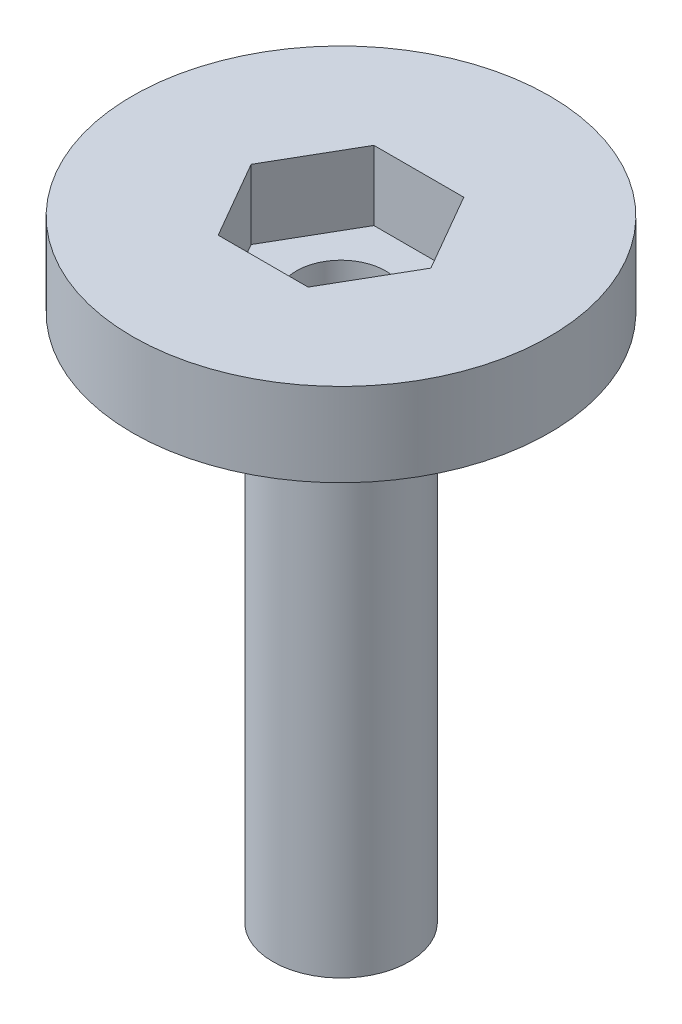
ISO-10303-21;
HEADER;
FILE_DESCRIPTION(('STEP AP214'),'2;1');
FILE_NAME('part.step','',(''),(''),'','','');
FILE_SCHEMA(('AUTOMOTIVE_DESIGN { 1 0 10303 214 1 1 1 1 }'));
ENDSEC;
DATA;
#1=APPLICATION_CONTEXT('core data for automotive mechanical design processes');
#2=APPLICATION_PROTOCOL_DEFINITION('international standard','automotive_design',2000,#1);
#3=PRODUCT_CONTEXT('',#1,'mechanical');
#4=PRODUCT('Part','Part','',(#3));
#5=PRODUCT_RELATED_PRODUCT_CATEGORY('part','',(#4));
#6=PRODUCT_DEFINITION_FORMATION('','',#4);
#7=PRODUCT_DEFINITION_CONTEXT('part definition',#1,'design');
#8=PRODUCT_DEFINITION('design','',#6,#7);
#9=PRODUCT_DEFINITION_SHAPE('','',#8);
#10=(LENGTH_UNIT() NAMED_UNIT(*) SI_UNIT(.MILLI.,.METRE.));
#11=(NAMED_UNIT(*) PLANE_ANGLE_UNIT() SI_UNIT($,.RADIAN.));
#12=(NAMED_UNIT(*) SI_UNIT($,.STERADIAN.) SOLID_ANGLE_UNIT());
#13=UNCERTAINTY_MEASURE_WITH_UNIT(LENGTH_MEASURE(1.E-05),#10,'distance_accuracy_value','');
#14=(GEOMETRIC_REPRESENTATION_CONTEXT(3) GLOBAL_UNCERTAINTY_ASSIGNED_CONTEXT((#13)) GLOBAL_UNIT_ASSIGNED_CONTEXT((#10,
#11,#12)) REPRESENTATION_CONTEXT('',''));
#15=CARTESIAN_POINT('',(0.,0.,0.));
#16=DIRECTION('',(0.,0.,1.));
#17=DIRECTION('',(1.,0.,0.));
#18=AXIS2_PLACEMENT_3D('',#15,#16,#17);
#19=CARTESIAN_POINT('',(0.,19.,0.));
#20=DIRECTION('',(0.,-1.,0.));
#21=DIRECTION('',(0.,0.,-1.));
#22=AXIS2_PLACEMENT_3D('',#19,#20,#21);
#23=CYLINDRICAL_SURFACE('',#22,1.6);
#24=CARTESIAN_POINT('',(0.,0.,0.));
#25=DIRECTION('',(0.,1.,0.));
#26=DIRECTION('',(0.,0.,1.));
#27=AXIS2_PLACEMENT_3D('',#24,#25,#26);
#28=CIRCLE('',#27,1.6);
#29=CARTESIAN_POINT('',(0.,0.,1.6));
#30=VERTEX_POINT('',#29);
#31=EDGE_CURVE('E151',#30,#30,#28,.T.);
#32=ORIENTED_EDGE('',*,*,#31,.F.);
#33=EDGE_LOOP('',(#32));
#34=FACE_BOUND('',#33,.T.);
#35=CARTESIAN_POINT('',(0.,19.5,0.));
#36=DIRECTION('',(0.,1.,0.));
#37=DIRECTION('',(0.,0.,1.));
#38=AXIS2_PLACEMENT_3D('',#35,#36,#37);
#39=CIRCLE('',#38,1.6);
#40=CARTESIAN_POINT('',(0.,19.5,1.6));
#41=VERTEX_POINT('',#40);
#42=EDGE_CURVE('E43',#41,#41,#39,.T.);
#43=ORIENTED_EDGE('',*,*,#42,.T.);
#44=EDGE_LOOP('',(#43));
#45=FACE_BOUND('',#44,.T.);
#46=ADVANCED_FACE('F39',(#34,#45),#23,.F.);
#47=CARTESIAN_POINT('',(0.,0.,0.));
#48=DIRECTION('',(0.,1.,0.));
#49=DIRECTION('',(0.,0.,1.));
#50=AXIS2_PLACEMENT_3D('',#47,#48,#49);
#51=PLANE('',#50);
#52=CARTESIAN_POINT('',(0.,0.,0.));
#53=DIRECTION('',(0.,1.,0.));
#54=DIRECTION('',(0.,0.,1.));
#55=AXIS2_PLACEMENT_3D('',#52,#53,#54);
#56=CIRCLE('',#55,2.45);
#57=CARTESIAN_POINT('',(0.,0.,2.45));
#58=VERTEX_POINT('',#57);
#59=EDGE_CURVE('E48',#58,#58,#56,.T.);
#60=ORIENTED_EDGE('',*,*,#59,.F.);
#61=EDGE_LOOP('',(#60));
#62=FACE_BOUND('',#61,.T.);
#63=ORIENTED_EDGE('',*,*,#31,.T.);
#64=EDGE_LOOP('',(#63));
#65=FACE_BOUND('',#64,.T.);
#66=ADVANCED_FACE('F160',(#62,#65),#51,.F.);
#67=CARTESIAN_POINT('',(0.,19.,0.));
#68=DIRECTION('',(0.,-1.,0.));
#69=DIRECTION('',(0.,0.,-1.));
#70=AXIS2_PLACEMENT_3D('',#67,#68,#69);
#71=CYLINDRICAL_SURFACE('',#70,2.45);
#72=CARTESIAN_POINT('',(0.,19.,0.));
#73=DIRECTION('',(0.,1.,0.));
#74=DIRECTION('',(0.,0.,1.));
#75=AXIS2_PLACEMENT_3D('',#72,#73,#74);
#76=CIRCLE('',#75,2.45);
#77=CARTESIAN_POINT('',(0.,19.,2.45));
#78=VERTEX_POINT('',#77);
#79=EDGE_CURVE('E11',#78,#78,#76,.T.);
#80=ORIENTED_EDGE('',*,*,#79,.F.);
#81=EDGE_LOOP('',(#80));
#82=FACE_BOUND('',#81,.T.);
#83=ORIENTED_EDGE('',*,*,#59,.T.);
#84=EDGE_LOOP('',(#83));
#85=FACE_BOUND('',#84,.T.);
#86=ADVANCED_FACE('F41',(#82,#85),#71,.T.);
#87=CARTESIAN_POINT('',(0.,22.,0.));
#88=DIRECTION('',(0.,-1.,0.));
#89=DIRECTION('',(0.,0.,-1.));
#90=AXIS2_PLACEMENT_3D('',#87,#88,#89);
#91=CYLINDRICAL_SURFACE('',#90,7.5);
#92=CARTESIAN_POINT('',(0.,22.,0.));
#93=DIRECTION('',(0.,1.,0.));
#94=DIRECTION('',(0.,0.,1.));
#95=AXIS2_PLACEMENT_3D('',#92,#93,#94);
#96=CIRCLE('',#95,7.5);
#97=CARTESIAN_POINT('',(0.,22.,7.5));
#98=VERTEX_POINT('',#97);
#99=EDGE_CURVE('E148',#98,#98,#96,.T.);
#100=ORIENTED_EDGE('',*,*,#99,.F.);
#101=EDGE_LOOP('',(#100));
#102=FACE_BOUND('',#101,.T.);
#103=CARTESIAN_POINT('',(0.,19.,0.));
#104=DIRECTION('',(0.,1.,0.));
#105=DIRECTION('',(0.,0.,1.));
#106=AXIS2_PLACEMENT_3D('',#103,#104,#105);
#107=CIRCLE('',#106,7.5);
#108=CARTESIAN_POINT('',(0.,19.,7.5));
#109=VERTEX_POINT('',#108);
#110=EDGE_CURVE('E152',#109,#109,#107,.T.);
#111=ORIENTED_EDGE('',*,*,#110,.T.);
#112=EDGE_LOOP('',(#111));
#113=FACE_BOUND('',#112,.T.);
#114=ADVANCED_FACE('F198',(#102,#113),#91,.T.);
#115=CARTESIAN_POINT('',(0.,22.,0.));
#116=DIRECTION('',(0.,1.,0.));
#117=DIRECTION('',(0.,0.,1.));
#118=AXIS2_PLACEMENT_3D('',#115,#116,#117);
#119=PLANE('',#118);
#120=DIRECTION('',(0.5,0.,-0.866025403784439));
#121=VECTOR('',#120,1.);
#122=CARTESIAN_POINT('',(1.61658075373095,22.,2.8));
#123=LINE('',#122,#121);
#124=CARTESIAN_POINT('',(1.61658075373095,22.,2.8));
#125=VERTEX_POINT('',#124);
#126=CARTESIAN_POINT('',(3.2331615074619,22.,0.));
#127=VERTEX_POINT('',#126);
#128=EDGE_CURVE('E56',#125,#127,#123,.T.);
#129=ORIENTED_EDGE('',*,*,#128,.F.);
#130=DIRECTION('',(1.,0.,0.));
#131=VECTOR('',#130,1.);
#132=CARTESIAN_POINT('',(-1.61658075373095,22.,2.8));
#133=LINE('',#132,#131);
#134=CARTESIAN_POINT('',(-1.61658075373095,22.,2.8));
#135=VERTEX_POINT('',#134);
#136=EDGE_CURVE('E139',#135,#125,#133,.T.);
#137=ORIENTED_EDGE('',*,*,#136,.F.);
#138=DIRECTION('',(0.5,0.,0.866025403784439));
#139=VECTOR('',#138,1.);
#140=CARTESIAN_POINT('',(-3.2331615074619,22.,0.));
#141=LINE('',#140,#139);
#142=CARTESIAN_POINT('',(-3.2331615074619,22.,0.));
#143=VERTEX_POINT('',#142);
#144=EDGE_CURVE('E137',#143,#135,#141,.T.);
#145=ORIENTED_EDGE('',*,*,#144,.F.);
#146=DIRECTION('',(-0.5,0.,0.866025403784439));
#147=VECTOR('',#146,1.);
#148=CARTESIAN_POINT('',(-1.61658075373095,22.,-2.8));
#149=LINE('',#148,#147);
#150=CARTESIAN_POINT('',(-1.61658075373095,22.,-2.8));
#151=VERTEX_POINT('',#150);
#152=EDGE_CURVE('E104',#151,#143,#149,.T.);
#153=ORIENTED_EDGE('',*,*,#152,.F.);
#154=DIRECTION('',(-1.,0.,0.));
#155=VECTOR('',#154,1.);
#156=CARTESIAN_POINT('',(1.61658075373095,22.,-2.8));
#157=LINE('',#156,#155);
#158=CARTESIAN_POINT('',(1.61658075373095,22.,-2.8));
#159=VERTEX_POINT('',#158);
#160=EDGE_CURVE('E133',#159,#151,#157,.T.);
#161=ORIENTED_EDGE('',*,*,#160,.F.);
#162=DIRECTION('',(-0.5,0.,-0.866025403784438));
#163=VECTOR('',#162,1.);
#164=CARTESIAN_POINT('',(3.23316150746191,22.,0.));
#165=LINE('',#164,#163);
#166=EDGE_CURVE('E130',#127,#159,#165,.T.);
#167=ORIENTED_EDGE('',*,*,#166,.F.);
#168=EDGE_LOOP('',(#129,#137,#145,#153,#161,#167));
#169=FACE_BOUND('',#168,.T.);
#170=ORIENTED_EDGE('',*,*,#99,.T.);
#171=EDGE_LOOP('',(#170));
#172=FACE_BOUND('',#171,.T.);
#173=ADVANCED_FACE('F195',(#169,#172),#119,.T.);
#174=CARTESIAN_POINT('',(0.,19.,0.));
#175=DIRECTION('',(0.,1.,0.));
#176=DIRECTION('',(0.,0.,1.));
#177=AXIS2_PLACEMENT_3D('',#174,#175,#176);
#178=PLANE('',#177);
#179=ORIENTED_EDGE('',*,*,#79,.T.);
#180=EDGE_LOOP('',(#179));
#181=FACE_BOUND('',#180,.T.);
#182=ORIENTED_EDGE('',*,*,#110,.F.);
#183=EDGE_LOOP('',(#182));
#184=FACE_BOUND('',#183,.T.);
#185=ADVANCED_FACE('F194',(#181,#184),#178,.F.);
#186=CARTESIAN_POINT('',(1.61658075373095,19.5,2.8));
#187=DIRECTION('',(0.866025403784439,0.,0.5));
#188=DIRECTION('',(0.5,0.,-0.866025403784439));
#189=AXIS2_PLACEMENT_3D('',#186,#187,#188);
#190=PLANE('',#189);
#191=ORIENTED_EDGE('',*,*,#128,.T.);
#192=DIRECTION('',(0.,1.,0.));
#193=VECTOR('',#192,1.);
#194=CARTESIAN_POINT('',(3.23316150746191,19.5,0.));
#195=LINE('',#194,#193);
#196=CARTESIAN_POINT('',(3.23316150746191,19.5,0.));
#197=VERTEX_POINT('',#196);
#198=EDGE_CURVE('E86',#197,#127,#195,.T.);
#199=ORIENTED_EDGE('',*,*,#198,.F.);
#200=DIRECTION('',(0.5,0.,-0.866025403784439));
#201=VECTOR('',#200,1.);
#202=CARTESIAN_POINT('',(1.61658075373095,19.5,2.8));
#203=LINE('',#202,#201);
#204=CARTESIAN_POINT('',(1.61658075373095,19.5,2.8));
#205=VERTEX_POINT('',#204);
#206=EDGE_CURVE('E141',#205,#197,#203,.T.);
#207=ORIENTED_EDGE('',*,*,#206,.F.);
#208=DIRECTION('',(0.,1.,0.));
#209=VECTOR('',#208,1.);
#210=CARTESIAN_POINT('',(1.61658075373095,19.5,2.8));
#211=LINE('',#210,#209);
#212=EDGE_CURVE('E64',#205,#125,#211,.T.);
#213=ORIENTED_EDGE('',*,*,#212,.T.);
#214=EDGE_LOOP('',(#191,#199,#207,#213));
#215=FACE_BOUND('',#214,.T.);
#216=ADVANCED_FACE('F184',(#215),#190,.F.);
#217=CARTESIAN_POINT('',(-1.61658075373095,19.5,2.8));
#218=DIRECTION('',(0.,0.,1.));
#219=DIRECTION('',(1.,0.,0.));
#220=AXIS2_PLACEMENT_3D('',#217,#218,#219);
#221=PLANE('',#220);
#222=ORIENTED_EDGE('',*,*,#136,.T.);
#223=ORIENTED_EDGE('',*,*,#212,.F.);
#224=DIRECTION('',(1.,0.,0.));
#225=VECTOR('',#224,1.);
#226=CARTESIAN_POINT('',(-1.61658075373095,19.5,2.8));
#227=LINE('',#226,#225);
#228=CARTESIAN_POINT('',(-1.61658075373095,19.5,2.8));
#229=VERTEX_POINT('',#228);
#230=EDGE_CURVE('E116',#229,#205,#227,.T.);
#231=ORIENTED_EDGE('',*,*,#230,.F.);
#232=DIRECTION('',(0.,1.,0.));
#233=VECTOR('',#232,1.);
#234=CARTESIAN_POINT('',(-1.61658075373095,19.5,2.8));
#235=LINE('',#234,#233);
#236=EDGE_CURVE('E108',#229,#135,#235,.T.);
#237=ORIENTED_EDGE('',*,*,#236,.T.);
#238=EDGE_LOOP('',(#222,#223,#231,#237));
#239=FACE_BOUND('',#238,.T.);
#240=ADVANCED_FACE('F181',(#239),#221,.F.);
#241=CARTESIAN_POINT('',(-3.2331615074619,19.5,0.));
#242=DIRECTION('',(-0.866025403784439,0.,0.5));
#243=DIRECTION('',(0.5,0.,0.866025403784439));
#244=AXIS2_PLACEMENT_3D('',#241,#242,#243);
#245=PLANE('',#244);
#246=ORIENTED_EDGE('',*,*,#144,.T.);
#247=ORIENTED_EDGE('',*,*,#236,.F.);
#248=DIRECTION('',(0.5,0.,0.866025403784439));
#249=VECTOR('',#248,1.);
#250=CARTESIAN_POINT('',(-3.2331615074619,19.5,0.));
#251=LINE('',#250,#249);
#252=CARTESIAN_POINT('',(-3.2331615074619,19.5,0.));
#253=VERTEX_POINT('',#252);
#254=EDGE_CURVE('E112',#253,#229,#251,.T.);
#255=ORIENTED_EDGE('',*,*,#254,.F.);
#256=DIRECTION('',(0.,1.,0.));
#257=VECTOR('',#256,1.);
#258=CARTESIAN_POINT('',(-3.2331615074619,19.5,0.));
#259=LINE('',#258,#257);
#260=EDGE_CURVE('E97',#253,#143,#259,.T.);
#261=ORIENTED_EDGE('',*,*,#260,.T.);
#262=EDGE_LOOP('',(#246,#247,#255,#261));
#263=FACE_BOUND('',#262,.T.);
#264=ADVANCED_FACE('F113',(#263),#245,.F.);
#265=CARTESIAN_POINT('',(-1.61658075373095,19.5,-2.8));
#266=DIRECTION('',(-0.866025403784439,0.,-0.5));
#267=DIRECTION('',(-0.5,0.,0.866025403784439));
#268=AXIS2_PLACEMENT_3D('',#265,#266,#267);
#269=PLANE('',#268);
#270=ORIENTED_EDGE('',*,*,#152,.T.);
#271=ORIENTED_EDGE('',*,*,#260,.F.);
#272=DIRECTION('',(-0.5,0.,0.866025403784439));
#273=VECTOR('',#272,1.);
#274=CARTESIAN_POINT('',(-1.61658075373095,19.5,-2.8));
#275=LINE('',#274,#273);
#276=CARTESIAN_POINT('',(-1.61658075373095,19.5,-2.8));
#277=VERTEX_POINT('',#276);
#278=EDGE_CURVE('E101',#277,#253,#275,.T.);
#279=ORIENTED_EDGE('',*,*,#278,.F.);
#280=DIRECTION('',(0.,1.,0.));
#281=VECTOR('',#280,1.);
#282=CARTESIAN_POINT('',(-1.61658075373095,19.5,-2.8));
#283=LINE('',#282,#281);
#284=EDGE_CURVE('E109',#277,#151,#283,.T.);
#285=ORIENTED_EDGE('',*,*,#284,.T.);
#286=EDGE_LOOP('',(#270,#271,#279,#285));
#287=FACE_BOUND('',#286,.T.);
#288=ADVANCED_FACE('F99',(#287),#269,.F.);
#289=CARTESIAN_POINT('',(1.61658075373095,19.5,-2.8));
#290=DIRECTION('',(0.,0.,-1.));
#291=DIRECTION('',(-1.,0.,0.));
#292=AXIS2_PLACEMENT_3D('',#289,#290,#291);
#293=PLANE('',#292);
#294=ORIENTED_EDGE('',*,*,#160,.T.);
#295=ORIENTED_EDGE('',*,*,#284,.F.);
#296=DIRECTION('',(-1.,0.,0.));
#297=VECTOR('',#296,1.);
#298=CARTESIAN_POINT('',(1.61658075373095,19.5,-2.8));
#299=LINE('',#298,#297);
#300=CARTESIAN_POINT('',(1.61658075373095,19.5,-2.8));
#301=VERTEX_POINT('',#300);
#302=EDGE_CURVE('E122',#301,#277,#299,.T.);
#303=ORIENTED_EDGE('',*,*,#302,.F.);
#304=DIRECTION('',(0.,1.,0.));
#305=VECTOR('',#304,1.);
#306=CARTESIAN_POINT('',(1.61658075373095,19.5,-2.8));
#307=LINE('',#306,#305);
#308=EDGE_CURVE('E145',#301,#159,#307,.T.);
#309=ORIENTED_EDGE('',*,*,#308,.T.);
#310=EDGE_LOOP('',(#294,#295,#303,#309));
#311=FACE_BOUND('',#310,.T.);
#312=ADVANCED_FACE('F177',(#311),#293,.F.);
#313=CARTESIAN_POINT('',(3.23316150746191,19.5,0.));
#314=DIRECTION('',(0.866025403784438,0.,-0.5));
#315=DIRECTION('',(-0.5,0.,-0.866025403784438));
#316=AXIS2_PLACEMENT_3D('',#313,#314,#315);
#317=PLANE('',#316);
#318=ORIENTED_EDGE('',*,*,#166,.T.);
#319=ORIENTED_EDGE('',*,*,#308,.F.);
#320=DIRECTION('',(-0.5,0.,-0.866025403784438));
#321=VECTOR('',#320,1.);
#322=CARTESIAN_POINT('',(3.23316150746191,19.5,0.));
#323=LINE('',#322,#321);
#324=EDGE_CURVE('E124',#197,#301,#323,.T.);
#325=ORIENTED_EDGE('',*,*,#324,.F.);
#326=ORIENTED_EDGE('',*,*,#198,.T.);
#327=EDGE_LOOP('',(#318,#319,#325,#326));
#328=FACE_BOUND('',#327,.T.);
#329=ADVANCED_FACE('F172',(#328),#317,.F.);
#330=CARTESIAN_POINT('',(0.,19.5,0.));
#331=DIRECTION('',(0.,1.,0.));
#332=DIRECTION('',(0.,0.,1.));
#333=AXIS2_PLACEMENT_3D('',#330,#331,#332);
#334=PLANE('',#333);
#335=ORIENTED_EDGE('',*,*,#42,.F.);
#336=EDGE_LOOP('',(#335));
#337=FACE_BOUND('',#336,.T.);
#338=ORIENTED_EDGE('',*,*,#206,.T.);
#339=ORIENTED_EDGE('',*,*,#324,.T.);
#340=ORIENTED_EDGE('',*,*,#302,.T.);
#341=ORIENTED_EDGE('',*,*,#278,.T.);
#342=ORIENTED_EDGE('',*,*,#254,.T.);
#343=ORIENTED_EDGE('',*,*,#230,.T.);
#344=EDGE_LOOP('',(#338,#339,#340,#341,#342,#343));
#345=FACE_BOUND('',#344,.T.);
#346=ADVANCED_FACE('F119',(#337,#345),#334,.T.);
#347=CLOSED_SHELL('',(#46,#66,#86,#114,#173,#185,#216,#240,#264,#288,#312,#329,#346));
#348=MANIFOLD_SOLID_BREP('B2',#347);
#349=ADVANCED_BREP_SHAPE_REPRESENTATION('',(#18,#348),#14);
#350=SHAPE_DEFINITION_REPRESENTATION(#9,#349);
ENDSEC;
END-ISO-10303-21;
